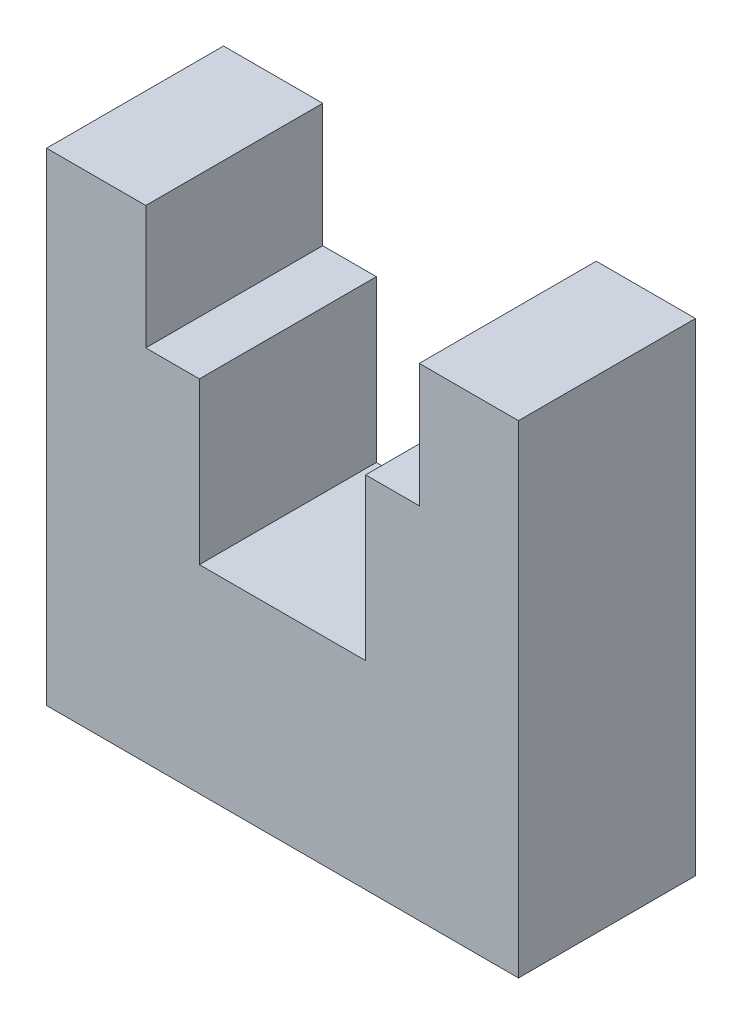
ISO-10303-21;
HEADER;
FILE_DESCRIPTION(('STEP AP214'),'2;1');
FILE_NAME('part.step','',(''),(''),'','','');
FILE_SCHEMA(('AUTOMOTIVE_DESIGN { 1 0 10303 214 1 1 1 1 }'));
ENDSEC;
DATA;
#1=APPLICATION_CONTEXT('core data for automotive mechanical design processes');
#2=APPLICATION_PROTOCOL_DEFINITION('international standard','automotive_design',2000,#1);
#3=PRODUCT_CONTEXT('',#1,'mechanical');
#4=PRODUCT('Part','Part','',(#3));
#5=PRODUCT_RELATED_PRODUCT_CATEGORY('part','',(#4));
#6=PRODUCT_DEFINITION_FORMATION('','',#4);
#7=PRODUCT_DEFINITION_CONTEXT('part definition',#1,'design');
#8=PRODUCT_DEFINITION('design','',#6,#7);
#9=PRODUCT_DEFINITION_SHAPE('','',#8);
#10=(LENGTH_UNIT() NAMED_UNIT(*) SI_UNIT(.MILLI.,.METRE.));
#11=(NAMED_UNIT(*) PLANE_ANGLE_UNIT() SI_UNIT($,.RADIAN.));
#12=(NAMED_UNIT(*) SI_UNIT($,.STERADIAN.) SOLID_ANGLE_UNIT());
#13=UNCERTAINTY_MEASURE_WITH_UNIT(LENGTH_MEASURE(1.E-05),#10,'distance_accuracy_value','');
#14=(GEOMETRIC_REPRESENTATION_CONTEXT(3) GLOBAL_UNCERTAINTY_ASSIGNED_CONTEXT((#13)) GLOBAL_UNIT_ASSIGNED_CONTEXT((#10,
#11,#12)) REPRESENTATION_CONTEXT('',''));
#15=CARTESIAN_POINT('',(0.,0.,0.));
#16=DIRECTION('',(0.,0.,1.));
#17=DIRECTION('',(1.,0.,0.));
#18=AXIS2_PLACEMENT_3D('',#15,#16,#17);
#19=CARTESIAN_POINT('',(0.,0.,3.3));
#20=DIRECTION('',(0.,1.,0.));
#21=DIRECTION('',(-1.,0.,0.));
#22=AXIS2_PLACEMENT_3D('',#19,#20,#21);
#23=PLANE('',#22);
#24=DIRECTION('',(1.,0.,0.));
#25=VECTOR('',#24,1.);
#26=CARTESIAN_POINT('',(0.,0.,0.));
#27=LINE('',#26,#25);
#28=CARTESIAN_POINT('',(-4.4,0.,0.));
#29=VERTEX_POINT('',#28);
#30=CARTESIAN_POINT('',(4.4,0.,0.));
#31=VERTEX_POINT('',#30);
#32=EDGE_CURVE('E156',#29,#31,#27,.T.);
#33=ORIENTED_EDGE('',*,*,#32,.T.);
#34=DIRECTION('',(0.,0.,-1.));
#35=VECTOR('',#34,1.);
#36=CARTESIAN_POINT('',(4.4,0.,3.3));
#37=LINE('',#36,#35);
#38=CARTESIAN_POINT('',(4.4,0.,3.3));
#39=VERTEX_POINT('',#38);
#40=EDGE_CURVE('E11',#39,#31,#37,.T.);
#41=ORIENTED_EDGE('',*,*,#40,.F.);
#42=DIRECTION('',(1.,0.,0.));
#43=VECTOR('',#42,1.);
#44=CARTESIAN_POINT('',(0.,0.,3.3));
#45=LINE('',#44,#43);
#46=CARTESIAN_POINT('',(-4.4,0.,3.3));
#47=VERTEX_POINT('',#46);
#48=EDGE_CURVE('E102',#47,#39,#45,.T.);
#49=ORIENTED_EDGE('',*,*,#48,.F.);
#50=DIRECTION('',(0.,0.,-1.));
#51=VECTOR('',#50,1.);
#52=CARTESIAN_POINT('',(-4.4,0.,3.3));
#53=LINE('',#52,#51);
#54=EDGE_CURVE('E155',#47,#29,#53,.T.);
#55=ORIENTED_EDGE('',*,*,#54,.T.);
#56=EDGE_LOOP('',(#33,#41,#49,#55));
#57=FACE_BOUND('',#56,.T.);
#58=ADVANCED_FACE('F35',(#57),#23,.F.);
#59=CARTESIAN_POINT('',(4.4,0.,3.3));
#60=DIRECTION('',(1.,0.,0.));
#61=DIRECTION('',(0.,1.,0.));
#62=AXIS2_PLACEMENT_3D('',#59,#60,#61);
#63=PLANE('',#62);
#64=DIRECTION('',(0.,-1.,0.));
#65=VECTOR('',#64,1.);
#66=CARTESIAN_POINT('',(4.4,0.,0.));
#67=LINE('',#66,#65);
#68=CARTESIAN_POINT('',(4.4,9.,0.));
#69=VERTEX_POINT('',#68);
#70=EDGE_CURVE('E159',#69,#31,#67,.T.);
#71=ORIENTED_EDGE('',*,*,#70,.F.);
#72=DIRECTION('',(0.,0.,-1.));
#73=VECTOR('',#72,1.);
#74=CARTESIAN_POINT('',(4.4,9.,3.3));
#75=LINE('',#74,#73);
#76=CARTESIAN_POINT('',(4.4,9.,3.3));
#77=VERTEX_POINT('',#76);
#78=EDGE_CURVE('E43',#77,#69,#75,.T.);
#79=ORIENTED_EDGE('',*,*,#78,.F.);
#80=DIRECTION('',(0.,-1.,0.));
#81=VECTOR('',#80,1.);
#82=CARTESIAN_POINT('',(4.4,0.,3.3));
#83=LINE('',#82,#81);
#84=EDGE_CURVE('E367',#77,#39,#83,.T.);
#85=ORIENTED_EDGE('',*,*,#84,.T.);
#86=ORIENTED_EDGE('',*,*,#40,.T.);
#87=EDGE_LOOP('',(#71,#79,#85,#86));
#88=FACE_BOUND('',#87,.T.);
#89=ADVANCED_FACE('F209',(#88),#63,.T.);
#90=CARTESIAN_POINT('',(0.,9.,3.3));
#91=DIRECTION('',(0.,1.,0.));
#92=DIRECTION('',(0.,0.,1.));
#93=AXIS2_PLACEMENT_3D('',#90,#91,#92);
#94=PLANE('',#93);
#95=DIRECTION('',(1.,0.,0.));
#96=VECTOR('',#95,1.);
#97=CARTESIAN_POINT('',(0.,9.,0.));
#98=LINE('',#97,#96);
#99=CARTESIAN_POINT('',(2.55,9.,0.));
#100=VERTEX_POINT('',#99);
#101=EDGE_CURVE('E162',#100,#69,#98,.T.);
#102=ORIENTED_EDGE('',*,*,#101,.F.);
#103=DIRECTION('',(0.,0.,-1.));
#104=VECTOR('',#103,1.);
#105=CARTESIAN_POINT('',(2.55,9.,3.3));
#106=LINE('',#105,#104);
#107=CARTESIAN_POINT('',(2.55,9.,3.3));
#108=VERTEX_POINT('',#107);
#109=EDGE_CURVE('E199',#108,#100,#106,.T.);
#110=ORIENTED_EDGE('',*,*,#109,.F.);
#111=DIRECTION('',(1.,0.,0.));
#112=VECTOR('',#111,1.);
#113=CARTESIAN_POINT('',(0.,9.,3.3));
#114=LINE('',#113,#112);
#115=EDGE_CURVE('E206',#108,#77,#114,.T.);
#116=ORIENTED_EDGE('',*,*,#115,.T.);
#117=ORIENTED_EDGE('',*,*,#78,.T.);
#118=EDGE_LOOP('',(#102,#110,#116,#117));
#119=FACE_BOUND('',#118,.T.);
#120=ADVANCED_FACE('F204',(#119),#94,.T.);
#121=CARTESIAN_POINT('',(2.55,0.,3.3));
#122=DIRECTION('',(1.,0.,0.));
#123=DIRECTION('',(0.,1.,0.));
#124=AXIS2_PLACEMENT_3D('',#121,#122,#123);
#125=PLANE('',#124);
#126=DIRECTION('',(0.,-1.,0.));
#127=VECTOR('',#126,1.);
#128=CARTESIAN_POINT('',(2.55,0.,0.));
#129=LINE('',#128,#127);
#130=CARTESIAN_POINT('',(2.55,6.7,0.));
#131=VERTEX_POINT('',#130);
#132=EDGE_CURVE('E165',#100,#131,#129,.T.);
#133=ORIENTED_EDGE('',*,*,#132,.T.);
#134=DIRECTION('',(0.,0.,-1.));
#135=VECTOR('',#134,1.);
#136=CARTESIAN_POINT('',(2.55,6.7,3.3));
#137=LINE('',#136,#135);
#138=CARTESIAN_POINT('',(2.55,6.7,3.3));
#139=VERTEX_POINT('',#138);
#140=EDGE_CURVE('E196',#139,#131,#137,.T.);
#141=ORIENTED_EDGE('',*,*,#140,.F.);
#142=DIRECTION('',(0.,-1.,0.));
#143=VECTOR('',#142,1.);
#144=CARTESIAN_POINT('',(2.55,0.,3.3));
#145=LINE('',#144,#143);
#146=EDGE_CURVE('E227',#108,#139,#145,.T.);
#147=ORIENTED_EDGE('',*,*,#146,.F.);
#148=ORIENTED_EDGE('',*,*,#109,.T.);
#149=EDGE_LOOP('',(#133,#141,#147,#148));
#150=FACE_BOUND('',#149,.T.);
#151=ADVANCED_FACE('F218',(#150),#125,.F.);
#152=CARTESIAN_POINT('',(0.,6.7,3.3));
#153=DIRECTION('',(0.,-1.,0.));
#154=DIRECTION('',(1.,0.,0.));
#155=AXIS2_PLACEMENT_3D('',#152,#153,#154);
#156=PLANE('',#155);
#157=DIRECTION('',(-1.,0.,0.));
#158=VECTOR('',#157,1.);
#159=CARTESIAN_POINT('',(0.,6.7,0.));
#160=LINE('',#159,#158);
#161=CARTESIAN_POINT('',(1.55,6.7,0.));
#162=VERTEX_POINT('',#161);
#163=EDGE_CURVE('E167',#131,#162,#160,.T.);
#164=ORIENTED_EDGE('',*,*,#163,.T.);
#165=DIRECTION('',(0.,0.,-1.));
#166=VECTOR('',#165,1.);
#167=CARTESIAN_POINT('',(1.55,6.7,3.3));
#168=LINE('',#167,#166);
#169=CARTESIAN_POINT('',(1.55,6.7,3.3));
#170=VERTEX_POINT('',#169);
#171=EDGE_CURVE('E193',#170,#162,#168,.T.);
#172=ORIENTED_EDGE('',*,*,#171,.F.);
#173=DIRECTION('',(-1.,0.,0.));
#174=VECTOR('',#173,1.);
#175=CARTESIAN_POINT('',(0.,6.7,3.3));
#176=LINE('',#175,#174);
#177=EDGE_CURVE('E224',#139,#170,#176,.T.);
#178=ORIENTED_EDGE('',*,*,#177,.F.);
#179=ORIENTED_EDGE('',*,*,#140,.T.);
#180=EDGE_LOOP('',(#164,#172,#178,#179));
#181=FACE_BOUND('',#180,.T.);
#182=ADVANCED_FACE('F222',(#181),#156,.F.);
#183=CARTESIAN_POINT('',(1.55,0.,3.3));
#184=DIRECTION('',(1.,0.,0.));
#185=DIRECTION('',(0.,1.,0.));
#186=AXIS2_PLACEMENT_3D('',#183,#184,#185);
#187=PLANE('',#186);
#188=DIRECTION('',(0.,-1.,0.));
#189=VECTOR('',#188,1.);
#190=CARTESIAN_POINT('',(1.55,0.,0.));
#191=LINE('',#190,#189);
#192=CARTESIAN_POINT('',(1.55,3.7,0.));
#193=VERTEX_POINT('',#192);
#194=EDGE_CURVE('E169',#162,#193,#191,.T.);
#195=ORIENTED_EDGE('',*,*,#194,.T.);
#196=DIRECTION('',(0.,0.,-1.));
#197=VECTOR('',#196,1.);
#198=CARTESIAN_POINT('',(1.55,3.7,3.3));
#199=LINE('',#198,#197);
#200=CARTESIAN_POINT('',(1.55,3.7,3.3));
#201=VERTEX_POINT('',#200);
#202=EDGE_CURVE('E191',#201,#193,#199,.T.);
#203=ORIENTED_EDGE('',*,*,#202,.F.);
#204=DIRECTION('',(0.,-1.,0.));
#205=VECTOR('',#204,1.);
#206=CARTESIAN_POINT('',(1.55,0.,3.3));
#207=LINE('',#206,#205);
#208=EDGE_CURVE('E226',#170,#201,#207,.T.);
#209=ORIENTED_EDGE('',*,*,#208,.F.);
#210=ORIENTED_EDGE('',*,*,#171,.T.);
#211=EDGE_LOOP('',(#195,#203,#209,#210));
#212=FACE_BOUND('',#211,.T.);
#213=ADVANCED_FACE('F268',(#212),#187,.F.);
#214=CARTESIAN_POINT('',(0.,3.7,3.3));
#215=DIRECTION('',(0.,1.,0.));
#216=DIRECTION('',(-1.,0.,0.));
#217=AXIS2_PLACEMENT_3D('',#214,#215,#216);
#218=PLANE('',#217);
#219=DIRECTION('',(1.,0.,0.));
#220=VECTOR('',#219,1.);
#221=CARTESIAN_POINT('',(0.,3.7,0.));
#222=LINE('',#221,#220);
#223=CARTESIAN_POINT('',(-1.55,3.7,0.));
#224=VERTEX_POINT('',#223);
#225=EDGE_CURVE('E172',#224,#193,#222,.T.);
#226=ORIENTED_EDGE('',*,*,#225,.F.);
#227=DIRECTION('',(0.,0.,-1.));
#228=VECTOR('',#227,1.);
#229=CARTESIAN_POINT('',(-1.55,3.7,3.3));
#230=LINE('',#229,#228);
#231=CARTESIAN_POINT('',(-1.55,3.7,3.3));
#232=VERTEX_POINT('',#231);
#233=EDGE_CURVE('E189',#232,#224,#230,.T.);
#234=ORIENTED_EDGE('',*,*,#233,.F.);
#235=DIRECTION('',(1.,0.,0.));
#236=VECTOR('',#235,1.);
#237=CARTESIAN_POINT('',(0.,3.7,3.3));
#238=LINE('',#237,#236);
#239=EDGE_CURVE('E229',#232,#201,#238,.T.);
#240=ORIENTED_EDGE('',*,*,#239,.T.);
#241=ORIENTED_EDGE('',*,*,#202,.T.);
#242=EDGE_LOOP('',(#226,#234,#240,#241));
#243=FACE_BOUND('',#242,.T.);
#244=ADVANCED_FACE('F271',(#243),#218,.T.);
#245=CARTESIAN_POINT('',(-1.55,0.,3.3));
#246=DIRECTION('',(1.,0.,0.));
#247=DIRECTION('',(0.,1.,0.));
#248=AXIS2_PLACEMENT_3D('',#245,#246,#247);
#249=PLANE('',#248);
#250=DIRECTION('',(0.,-1.,0.));
#251=VECTOR('',#250,1.);
#252=CARTESIAN_POINT('',(-1.55,0.,0.));
#253=LINE('',#252,#251);
#254=CARTESIAN_POINT('',(-1.55,6.7,0.));
#255=VERTEX_POINT('',#254);
#256=EDGE_CURVE('E175',#255,#224,#253,.T.);
#257=ORIENTED_EDGE('',*,*,#256,.F.);
#258=DIRECTION('',(0.,0.,-1.));
#259=VECTOR('',#258,1.);
#260=CARTESIAN_POINT('',(-1.55,6.7,3.3));
#261=LINE('',#260,#259);
#262=CARTESIAN_POINT('',(-1.55,6.7,3.3));
#263=VERTEX_POINT('',#262);
#264=EDGE_CURVE('E187',#263,#255,#261,.T.);
#265=ORIENTED_EDGE('',*,*,#264,.F.);
#266=DIRECTION('',(0.,-1.,0.));
#267=VECTOR('',#266,1.);
#268=CARTESIAN_POINT('',(-1.55,0.,3.3));
#269=LINE('',#268,#267);
#270=EDGE_CURVE('E150',#263,#232,#269,.T.);
#271=ORIENTED_EDGE('',*,*,#270,.T.);
#272=ORIENTED_EDGE('',*,*,#233,.T.);
#273=EDGE_LOOP('',(#257,#265,#271,#272));
#274=FACE_BOUND('',#273,.T.);
#275=ADVANCED_FACE('F238',(#274),#249,.T.);
#276=CARTESIAN_POINT('',(0.,6.7,3.3));
#277=DIRECTION('',(0.,1.,0.));
#278=DIRECTION('',(0.,0.,1.));
#279=AXIS2_PLACEMENT_3D('',#276,#277,#278);
#280=PLANE('',#279);
#281=DIRECTION('',(1.,0.,0.));
#282=VECTOR('',#281,1.);
#283=CARTESIAN_POINT('',(0.,6.7,0.));
#284=LINE('',#283,#282);
#285=CARTESIAN_POINT('',(-2.55,6.7,0.));
#286=VERTEX_POINT('',#285);
#287=EDGE_CURVE('E178',#286,#255,#284,.T.);
#288=ORIENTED_EDGE('',*,*,#287,.F.);
#289=DIRECTION('',(0.,0.,-1.));
#290=VECTOR('',#289,1.);
#291=CARTESIAN_POINT('',(-2.55,6.7,3.3));
#292=LINE('',#291,#290);
#293=CARTESIAN_POINT('',(-2.55,6.7,3.3));
#294=VERTEX_POINT('',#293);
#295=EDGE_CURVE('E138',#294,#286,#292,.T.);
#296=ORIENTED_EDGE('',*,*,#295,.F.);
#297=DIRECTION('',(1.,0.,0.));
#298=VECTOR('',#297,1.);
#299=CARTESIAN_POINT('',(0.,6.7,3.3));
#300=LINE('',#299,#298);
#301=EDGE_CURVE('E148',#294,#263,#300,.T.);
#302=ORIENTED_EDGE('',*,*,#301,.T.);
#303=ORIENTED_EDGE('',*,*,#264,.T.);
#304=EDGE_LOOP('',(#288,#296,#302,#303));
#305=FACE_BOUND('',#304,.T.);
#306=ADVANCED_FACE('F243',(#305),#280,.T.);
#307=CARTESIAN_POINT('',(-2.55,0.,3.3));
#308=DIRECTION('',(1.,0.,0.));
#309=DIRECTION('',(0.,1.,0.));
#310=AXIS2_PLACEMENT_3D('',#307,#308,#309);
#311=PLANE('',#310);
#312=DIRECTION('',(0.,-1.,0.));
#313=VECTOR('',#312,1.);
#314=CARTESIAN_POINT('',(-2.55,0.,0.));
#315=LINE('',#314,#313);
#316=CARTESIAN_POINT('',(-2.55,9.,0.));
#317=VERTEX_POINT('',#316);
#318=EDGE_CURVE('E137',#317,#286,#315,.T.);
#319=ORIENTED_EDGE('',*,*,#318,.F.);
#320=DIRECTION('',(0.,0.,-1.));
#321=VECTOR('',#320,1.);
#322=CARTESIAN_POINT('',(-2.55,9.,3.3));
#323=LINE('',#322,#321);
#324=CARTESIAN_POINT('',(-2.55,9.,3.3));
#325=VERTEX_POINT('',#324);
#326=EDGE_CURVE('E131',#325,#317,#323,.T.);
#327=ORIENTED_EDGE('',*,*,#326,.F.);
#328=DIRECTION('',(0.,-1.,0.));
#329=VECTOR('',#328,1.);
#330=CARTESIAN_POINT('',(-2.55,0.,3.3));
#331=LINE('',#330,#329);
#332=EDGE_CURVE('E135',#325,#294,#331,.T.);
#333=ORIENTED_EDGE('',*,*,#332,.T.);
#334=ORIENTED_EDGE('',*,*,#295,.T.);
#335=EDGE_LOOP('',(#319,#327,#333,#334));
#336=FACE_BOUND('',#335,.T.);
#337=ADVANCED_FACE('F133',(#336),#311,.T.);
#338=CARTESIAN_POINT('',(0.,9.,3.3));
#339=DIRECTION('',(0.,-1.,0.));
#340=DIRECTION('',(1.,0.,0.));
#341=AXIS2_PLACEMENT_3D('',#338,#339,#340);
#342=PLANE('',#341);
#343=DIRECTION('',(-1.,0.,0.));
#344=VECTOR('',#343,1.);
#345=CARTESIAN_POINT('',(0.,9.,0.));
#346=LINE('',#345,#344);
#347=CARTESIAN_POINT('',(-4.4,9.,0.));
#348=VERTEX_POINT('',#347);
#349=EDGE_CURVE('E90',#317,#348,#346,.T.);
#350=ORIENTED_EDGE('',*,*,#349,.T.);
#351=DIRECTION('',(0.,0.,-1.));
#352=VECTOR('',#351,1.);
#353=CARTESIAN_POINT('',(-4.4,9.,3.3));
#354=LINE('',#353,#352);
#355=CARTESIAN_POINT('',(-4.4,9.,3.3));
#356=VERTEX_POINT('',#355);
#357=EDGE_CURVE('E139',#356,#348,#354,.T.);
#358=ORIENTED_EDGE('',*,*,#357,.F.);
#359=DIRECTION('',(-1.,0.,0.));
#360=VECTOR('',#359,1.);
#361=CARTESIAN_POINT('',(0.,9.,3.3));
#362=LINE('',#361,#360);
#363=EDGE_CURVE('E141',#325,#356,#362,.T.);
#364=ORIENTED_EDGE('',*,*,#363,.F.);
#365=ORIENTED_EDGE('',*,*,#326,.T.);
#366=EDGE_LOOP('',(#350,#358,#364,#365));
#367=FACE_BOUND('',#366,.T.);
#368=ADVANCED_FACE('F142',(#367),#342,.F.);
#369=CARTESIAN_POINT('',(-4.4,0.,3.3));
#370=DIRECTION('',(1.,0.,0.));
#371=DIRECTION('',(0.,1.,0.));
#372=AXIS2_PLACEMENT_3D('',#369,#370,#371);
#373=PLANE('',#372);
#374=DIRECTION('',(0.,-1.,0.));
#375=VECTOR('',#374,1.);
#376=CARTESIAN_POINT('',(-4.4,0.,0.));
#377=LINE('',#376,#375);
#378=EDGE_CURVE('E96',#348,#29,#377,.T.);
#379=ORIENTED_EDGE('',*,*,#378,.T.);
#380=ORIENTED_EDGE('',*,*,#54,.F.);
#381=DIRECTION('',(0.,-1.,0.));
#382=VECTOR('',#381,1.);
#383=CARTESIAN_POINT('',(-4.4,0.,3.3));
#384=LINE('',#383,#382);
#385=EDGE_CURVE('E51',#356,#47,#384,.T.);
#386=ORIENTED_EDGE('',*,*,#385,.F.);
#387=ORIENTED_EDGE('',*,*,#357,.T.);
#388=EDGE_LOOP('',(#379,#380,#386,#387));
#389=FACE_BOUND('',#388,.T.);
#390=ADVANCED_FACE('F245',(#389),#373,.F.);
#391=CARTESIAN_POINT('',(0.,0.,3.3));
#392=DIRECTION('',(0.,0.,1.));
#393=DIRECTION('',(1.,0.,0.));
#394=AXIS2_PLACEMENT_3D('',#391,#392,#393);
#395=PLANE('',#394);
#396=ORIENTED_EDGE('',*,*,#48,.T.);
#397=ORIENTED_EDGE('',*,*,#84,.F.);
#398=ORIENTED_EDGE('',*,*,#115,.F.);
#399=ORIENTED_EDGE('',*,*,#146,.T.);
#400=ORIENTED_EDGE('',*,*,#177,.T.);
#401=ORIENTED_EDGE('',*,*,#208,.T.);
#402=ORIENTED_EDGE('',*,*,#239,.F.);
#403=ORIENTED_EDGE('',*,*,#270,.F.);
#404=ORIENTED_EDGE('',*,*,#301,.F.);
#405=ORIENTED_EDGE('',*,*,#332,.F.);
#406=ORIENTED_EDGE('',*,*,#363,.T.);
#407=ORIENTED_EDGE('',*,*,#385,.T.);
#408=EDGE_LOOP('',(#396,#397,#398,#399,#400,#401,#402,#403,#404,#405,#406,#407));
#409=FACE_BOUND('',#408,.T.);
#410=ADVANCED_FACE('F145',(#409),#395,.T.);
#411=CARTESIAN_POINT('',(0.,0.,0.));
#412=DIRECTION('',(0.,0.,1.));
#413=DIRECTION('',(1.,0.,0.));
#414=AXIS2_PLACEMENT_3D('',#411,#412,#413);
#415=PLANE('',#414);
#416=ORIENTED_EDGE('',*,*,#32,.F.);
#417=ORIENTED_EDGE('',*,*,#378,.F.);
#418=ORIENTED_EDGE('',*,*,#349,.F.);
#419=ORIENTED_EDGE('',*,*,#318,.T.);
#420=ORIENTED_EDGE('',*,*,#287,.T.);
#421=ORIENTED_EDGE('',*,*,#256,.T.);
#422=ORIENTED_EDGE('',*,*,#225,.T.);
#423=ORIENTED_EDGE('',*,*,#194,.F.);
#424=ORIENTED_EDGE('',*,*,#163,.F.);
#425=ORIENTED_EDGE('',*,*,#132,.F.);
#426=ORIENTED_EDGE('',*,*,#101,.T.);
#427=ORIENTED_EDGE('',*,*,#70,.T.);
#428=EDGE_LOOP('',(#416,#417,#418,#419,#420,#421,#422,#423,#424,#425,#426,#427));
#429=FACE_BOUND('',#428,.T.);
#430=ADVANCED_FACE('F213',(#429),#415,.F.);
#431=CLOSED_SHELL('',(#58,#89,#120,#151,#182,#213,#244,#275,#306,#337,#368,#390,#410,#430));
#432=MANIFOLD_SOLID_BREP('B2',#431);
#433=ADVANCED_BREP_SHAPE_REPRESENTATION('',(#18,#432),#14);
#434=SHAPE_DEFINITION_REPRESENTATION(#9,#433);
ENDSEC;
END-ISO-10303-21;
